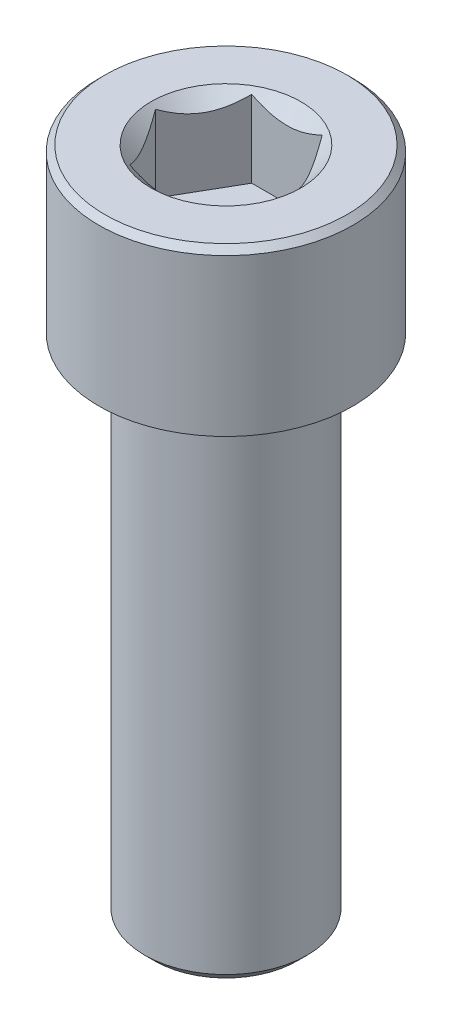
ISO-10303-21;
HEADER;
FILE_DESCRIPTION(('STEP AP214'),'2;1');
FILE_NAME('part.step','',(''),(''),'','','');
FILE_SCHEMA(('AUTOMOTIVE_DESIGN { 1 0 10303 214 1 1 1 1 }'));
ENDSEC;
DATA;
#1=APPLICATION_CONTEXT('core data for automotive mechanical design processes');
#2=APPLICATION_PROTOCOL_DEFINITION('international standard','automotive_design',2000,#1);
#3=PRODUCT_CONTEXT('',#1,'mechanical');
#4=PRODUCT('Part','Part','',(#3));
#5=PRODUCT_RELATED_PRODUCT_CATEGORY('part','',(#4));
#6=PRODUCT_DEFINITION_FORMATION('','',#4);
#7=PRODUCT_DEFINITION_CONTEXT('part definition',#1,'design');
#8=PRODUCT_DEFINITION('design','',#6,#7);
#9=PRODUCT_DEFINITION_SHAPE('','',#8);
#10=(LENGTH_UNIT() NAMED_UNIT(*) SI_UNIT(.MILLI.,.METRE.));
#11=(NAMED_UNIT(*) PLANE_ANGLE_UNIT() SI_UNIT($,.RADIAN.));
#12=(NAMED_UNIT(*) SI_UNIT($,.STERADIAN.) SOLID_ANGLE_UNIT());
#13=UNCERTAINTY_MEASURE_WITH_UNIT(LENGTH_MEASURE(1.E-05),#10,'distance_accuracy_value','');
#14=(GEOMETRIC_REPRESENTATION_CONTEXT(3) GLOBAL_UNCERTAINTY_ASSIGNED_CONTEXT((#13)) GLOBAL_UNIT_ASSIGNED_CONTEXT((#10,
#11,#12)) REPRESENTATION_CONTEXT('',''));
#15=CARTESIAN_POINT('',(0.,0.,0.));
#16=DIRECTION('',(0.,0.,1.));
#17=DIRECTION('',(1.,0.,0.));
#18=AXIS2_PLACEMENT_3D('',#15,#16,#17);
#19=CARTESIAN_POINT('',(0.,0.,0.));
#20=DIRECTION('',(0.,1.,0.));
#21=DIRECTION('',(0.,0.,1.));
#22=AXIS2_PLACEMENT_3D('',#19,#20,#21);
#23=PLANE('',#22);
#24=CARTESIAN_POINT('',(0.,0.,0.));
#25=DIRECTION('',(0.,1.,0.));
#26=DIRECTION('',(0.,0.,1.));
#27=AXIS2_PLACEMENT_3D('',#24,#25,#26);
#28=CIRCLE('',#27,3.5);
#29=CARTESIAN_POINT('',(0.,0.,3.5));
#30=VERTEX_POINT('',#29);
#31=EDGE_CURVE('E42',#30,#30,#28,.F.);
#32=ORIENTED_EDGE('',*,*,#31,.T.);
#33=EDGE_LOOP('',(#32));
#34=FACE_BOUND('',#33,.T.);
#35=ADVANCED_FACE('F34',(#34),#23,.F.);
#36=CARTESIAN_POINT('',(0.,0.,0.));
#37=DIRECTION('',(0.,-1.,0.));
#38=DIRECTION('',(0.,0.,-1.));
#39=AXIS2_PLACEMENT_3D('',#36,#37,#38);
#40=CYLINDRICAL_SURFACE('',#39,4.);
#41=CARTESIAN_POINT('',(0.,0.500000000000006,0.));
#42=DIRECTION('',(0.,1.,0.));
#43=DIRECTION('',(0.,0.,1.));
#44=AXIS2_PLACEMENT_3D('',#41,#42,#43);
#45=CIRCLE('',#44,4.);
#46=CARTESIAN_POINT('',(0.,0.500000000000006,4.));
#47=VERTEX_POINT('',#46);
#48=EDGE_CURVE('E11',#47,#47,#45,.T.);
#49=ORIENTED_EDGE('',*,*,#48,.T.);
#50=EDGE_LOOP('',(#49));
#51=FACE_BOUND('',#50,.T.);
#52=CARTESIAN_POINT('',(0.,25.,0.));
#53=DIRECTION('',(0.,-1.,0.));
#54=DIRECTION('',(0.,0.,-1.));
#55=AXIS2_PLACEMENT_3D('',#52,#53,#54);
#56=CIRCLE('',#55,4.);
#57=CARTESIAN_POINT('',(0.,25.,-4.));
#58=VERTEX_POINT('',#57);
#59=EDGE_CURVE('E119',#58,#58,#56,.T.);
#60=ORIENTED_EDGE('',*,*,#59,.T.);
#61=EDGE_LOOP('',(#60));
#62=FACE_BOUND('',#61,.T.);
#63=ADVANCED_FACE('F190',(#51,#62),#40,.T.);
#64=CARTESIAN_POINT('',(-4.,25.,0.));
#65=DIRECTION('',(0.,1.,0.));
#66=DIRECTION('',(0.,0.,1.));
#67=AXIS2_PLACEMENT_3D('',#64,#65,#66);
#68=PLANE('',#67);
#69=ORIENTED_EDGE('',*,*,#59,.F.);
#70=EDGE_LOOP('',(#69));
#71=FACE_BOUND('',#70,.T.);
#72=CARTESIAN_POINT('',(0.,25.,0.));
#73=DIRECTION('',(0.,-1.,0.));
#74=DIRECTION('',(0.,0.,-1.));
#75=AXIS2_PLACEMENT_3D('',#72,#73,#74);
#76=CIRCLE('',#75,6.25);
#77=CARTESIAN_POINT('',(0.,25.,-6.25));
#78=VERTEX_POINT('',#77);
#79=EDGE_CURVE('E116',#78,#78,#76,.T.);
#80=ORIENTED_EDGE('',*,*,#79,.T.);
#81=EDGE_LOOP('',(#80));
#82=FACE_BOUND('',#81,.T.);
#83=ADVANCED_FACE('F196',(#71,#82),#68,.F.);
#84=CARTESIAN_POINT('',(0.,0.,0.));
#85=DIRECTION('',(0.,-1.,0.));
#86=DIRECTION('',(0.,0.,-1.));
#87=AXIS2_PLACEMENT_3D('',#84,#85,#86);
#88=CYLINDRICAL_SURFACE('',#87,6.25);
#89=CARTESIAN_POINT('',(0.,32.7,0.));
#90=DIRECTION('',(0.,-1.,0.));
#91=DIRECTION('',(0.,0.,-1.));
#92=AXIS2_PLACEMENT_3D('',#89,#90,#91);
#93=CIRCLE('',#92,6.25);
#94=CARTESIAN_POINT('',(0.,32.7,-6.25));
#95=VERTEX_POINT('',#94);
#96=EDGE_CURVE('E122',#95,#95,#93,.T.);
#97=ORIENTED_EDGE('',*,*,#96,.T.);
#98=EDGE_LOOP('',(#97));
#99=FACE_BOUND('',#98,.T.);
#100=ORIENTED_EDGE('',*,*,#79,.F.);
#101=EDGE_LOOP('',(#100));
#102=FACE_BOUND('',#101,.T.);
#103=ADVANCED_FACE('F207',(#99,#102),#88,.T.);
#104=CARTESIAN_POINT('',(-6.25,33.,0.));
#105=DIRECTION('',(0.,-1.,0.));
#106=DIRECTION('',(0.,0.,-1.));
#107=AXIS2_PLACEMENT_3D('',#104,#105,#106);
#108=PLANE('',#107);
#109=CARTESIAN_POINT('',(0.,33.,0.));
#110=DIRECTION('',(0.,1.,0.));
#111=DIRECTION('',(0.,0.,1.));
#112=AXIS2_PLACEMENT_3D('',#109,#110,#111);
#113=CIRCLE('',#112,3.68172134015619);
#114=CARTESIAN_POINT('',(0.,33.,3.68172134015619));
#115=VERTEX_POINT('',#114);
#116=EDGE_CURVE('E337',#115,#115,#113,.T.);
#117=ORIENTED_EDGE('',*,*,#116,.F.);
#118=EDGE_LOOP('',(#117));
#119=FACE_BOUND('',#118,.T.);
#120=CARTESIAN_POINT('',(0.,33.,0.));
#121=DIRECTION('',(0.,-1.,0.));
#122=DIRECTION('',(0.,0.,-1.));
#123=AXIS2_PLACEMENT_3D('',#120,#121,#122);
#124=CIRCLE('',#123,5.95);
#125=CARTESIAN_POINT('',(0.,33.,-5.95));
#126=VERTEX_POINT('',#125);
#127=EDGE_CURVE('E93',#126,#126,#124,.F.);
#128=ORIENTED_EDGE('',*,*,#127,.T.);
#129=EDGE_LOOP('',(#128));
#130=FACE_BOUND('',#129,.T.);
#131=ADVANCED_FACE('F202',(#119,#130),#108,.F.);
#132=CARTESIAN_POINT('',(0.,32.7,0.));
#133=DIRECTION('',(0.,-1.,0.));
#134=DIRECTION('',(0.,0.,-1.));
#135=AXIS2_PLACEMENT_3D('',#132,#133,#134);
#136=CONICAL_SURFACE('',#135,6.25,0.785398163397447);
#137=ORIENTED_EDGE('',*,*,#127,.F.);
#138=EDGE_LOOP('',(#137));
#139=FACE_BOUND('',#138,.T.);
#140=ORIENTED_EDGE('',*,*,#96,.F.);
#141=EDGE_LOOP('',(#140));
#142=FACE_BOUND('',#141,.T.);
#143=ADVANCED_FACE('F138',(#139,#142),#136,.T.);
#144=CARTESIAN_POINT('',(0.,33.,0.));
#145=DIRECTION('',(0.,1.,0.));
#146=DIRECTION('',(0.,0.,1.));
#147=AXIS2_PLACEMENT_3D('',#144,#145,#146);
#148=CONICAL_SURFACE('',#147,3.68172134015619,0.785398163397449);
#149=ORIENTED_EDGE('',*,*,#116,.T.);
#150=EDGE_LOOP('',(#149));
#151=FACE_BOUND('',#150,.T.);
#152=CARTESIAN_POINT('',(-3.57414153717217,33.9845928078346,3.));
#153=CARTESIAN_POINT('',(-3.48763354421076,33.918347344031,3.));
#154=CARTESIAN_POINT('',(-3.40065485701271,33.8527068014046,3.));
#155=CARTESIAN_POINT('',(-3.22556536628367,33.7229105596247,3.));
#156=CARTESIAN_POINT('',(-3.13745429592207,33.6587552207989,3.));
#157=CARTESIAN_POINT('',(-2.95926502940819,33.5317477625692,3.));
#158=CARTESIAN_POINT('',(-2.86917689491203,33.4689095404859,3.));
#159=CARTESIAN_POINT('',(-2.68749351951163,33.3454583721269,3.));
#160=CARTESIAN_POINT('',(-2.5958983836401,33.2848452717117,3.));
#161=CARTESIAN_POINT('',(-2.40523426187287,33.1626856152111,3.));
#162=CARTESIAN_POINT('',(-2.30605328102178,33.1013129786067,3.));
#163=CARTESIAN_POINT('',(-2.10536506104801,32.9824325210317,3.));
#164=CARTESIAN_POINT('',(-2.00385743987678,32.9249253409785,3.));
#165=CARTESIAN_POINT('',(-1.79849745550954,32.8150046063731,3.));
#166=CARTESIAN_POINT('',(-1.69465316441122,32.7625760890662,3.));
#167=CARTESIAN_POINT('',(-1.48405420683512,32.663987161909,3.));
#168=CARTESIAN_POINT('',(-1.37730092797841,32.6178238242346,3.));
#169=CARTESIAN_POINT('',(-1.17088222190216,32.5374103113695,3.));
#170=CARTESIAN_POINT('',(-1.07149734601239,32.5024473221765,3.));
#171=CARTESIAN_POINT('',(-0.870230144552074,32.4404802404136,3.));
#172=CARTESIAN_POINT('',(-0.768347657354245,32.4134766643998,3.));
#173=CARTESIAN_POINT('',(-0.56444762477906,32.3693266023403,3.));
#174=CARTESIAN_POINT('',(-0.462468933304163,32.3520036676269,3.));
#175=CARTESIAN_POINT('',(-0.257288650084503,32.3275703633682,3.));
#176=CARTESIAN_POINT('',(-0.154087304614488,32.3204579712627,3.));
#177=CARTESIAN_POINT('',(0.0481861337271405,32.3170323431805,3.));
#178=CARTESIAN_POINT('',(0.147250905244534,32.3202810238262,3.));
#179=CARTESIAN_POINT('',(0.344589076655321,32.3364014246806,3.));
#180=CARTESIAN_POINT('',(0.442862402476964,32.3492740352571,3.));
#181=CARTESIAN_POINT('',(0.639570667541511,32.3841396910622,3.));
#182=CARTESIAN_POINT('',(0.737976852204936,32.4062922789742,3.));
#183=CARTESIAN_POINT('',(0.932628435913932,32.4585009084323,3.));
#184=CARTESIAN_POINT('',(1.02887397223985,32.4885564463,3.));
#185=CARTESIAN_POINT('',(1.22532003458176,32.5574747225556,3.));
#186=CARTESIAN_POINT('',(1.32536043310458,32.5967888675383,3.));
#187=CARTESIAN_POINT('',(1.5228495241282,32.6814775662887,3.));
#188=CARTESIAN_POINT('',(1.62029736425404,32.7268540844093,3.));
#189=CARTESIAN_POINT('',(1.8130860429893,32.8225985437204,3.));
#190=CARTESIAN_POINT('',(1.90841896877326,32.8729822890255,3.));
#191=CARTESIAN_POINT('',(2.09689622819786,32.9776272778976,3.));
#192=CARTESIAN_POINT('',(2.19004094502823,33.031887835746,3.));
#193=CARTESIAN_POINT('',(2.36987261179099,33.1407691556288,3.));
#194=CARTESIAN_POINT('',(2.45665114613525,33.1952394529636,3.));
#195=CARTESIAN_POINT('',(2.62871750489487,33.3064926464856,3.));
#196=CARTESIAN_POINT('',(2.71400521657293,33.3632757164947,3.));
#197=CARTESIAN_POINT('',(2.88259790064295,33.4782780272199,3.));
#198=CARTESIAN_POINT('',(2.96591330750258,33.5364820260229,3.));
#199=CARTESIAN_POINT('',(3.13140205426231,33.6544457904063,3.));
#200=CARTESIAN_POINT('',(3.21357570254096,33.7142051228644,3.));
#201=CARTESIAN_POINT('',(3.29527058173678,33.7746009335197,3.));
#202=B_SPLINE_CURVE_WITH_KNOTS('',3,(#152,#153,#154,#155,#156,#157,#158,#159,#160,#161,#162,
#163,#164,#165,#166,#167,#168,#169,#170,#171,#172,#173,#174,#175,#176,#177,#178,#179,#180,#181,
#182,#183,#184,#185,#186,#187,#188,#189,#190,#191,#192,#193,#194,#195,#196,#197,#198,#199,#200,
#201),.UNSPECIFIED.,.F.,.F.,(4,2,2,2,2,2,2,2,2,2,2,2,2,2,2,2,2,2,2,2,2,2,2,2,4),(0.,
0.326883534696339,0.653845561216814,0.983333574679484,1.31279872045119,1.66263039077581,
2.01251992306797,2.36134508374106,2.71000666706381,3.02579926641578,3.34161235580211,
3.65146388205707,3.96125402275306,4.25812208285704,4.55501761141499,4.85724167639794,
5.15944648441815,5.48166266665301,5.80398350895795,6.12735610013866,6.45067163510514,
6.75800096012908,7.06535342598929,7.37023156667126,7.67502569596997),.UNSPECIFIED.);
#203=CARTESIAN_POINT('',(-1.73205080756888,32.7823802749816,3.));
#204=VERTEX_POINT('',#203);
#205=CARTESIAN_POINT('',(1.73205080756888,32.7823802749816,3.));
#206=VERTEX_POINT('',#205);
#207=EDGE_CURVE('E100',#204,#206,#202,.T.);
#208=ORIENTED_EDGE('',*,*,#207,.F.);
#209=CARTESIAN_POINT('',(-3.46421708519159,32.7824957508087,-0.000199999999999535));
#210=CARTESIAN_POINT('',(-3.40467869607211,32.7230085933033,0.102923514955747));
#211=CARTESIAN_POINT('',(-3.3441447475778,32.6670152544471,0.207771389330649));
#212=CARTESIAN_POINT('',(-3.2207094063533,32.5644928713605,0.421567671781097));
#213=CARTESIAN_POINT('',(-3.15779627521275,32.5180208687229,0.530536411379762));
#214=CARTESIAN_POINT('',(-3.03093496880241,32.4384134634979,0.750266639597033));
#215=CARTESIAN_POINT('',(-2.96701910000606,32.4050779756242,0.860972171762216));
#216=CARTESIAN_POINT('',(-2.83778025907546,32.3537178189609,1.08482041056533));
#217=CARTESIAN_POINT('',(-2.77246123486019,32.3356548125172,1.197956279207));
#218=CARTESIAN_POINT('',(-2.65988677911464,32.3193571834321,1.39294095619271));
#219=CARTESIAN_POINT('',(-2.6127767304643,32.3169446421554,1.47453795400214));
#220=CARTESIAN_POINT('',(-2.51863325954798,32.3210097096387,1.6375992288301));
#221=CARTESIAN_POINT('',(-2.47159986993093,32.3274904350099,1.71906344929899));
#222=CARTESIAN_POINT('',(-2.37797867687426,32.3489719974968,1.88122011233838));
#223=CARTESIAN_POINT('',(-2.33139143122689,32.3639823649488,1.96191158878431));
#224=CARTESIAN_POINT('',(-2.23901705721438,32.4017039210476,2.12190869789134));
#225=CARTESIAN_POINT('',(-2.19322986779049,32.4244145193044,2.2012144363093));
#226=CARTESIAN_POINT('',(-2.11194373930153,32.4711409598355,2.34200614080276));
#227=CARTESIAN_POINT('',(-2.07626488907772,32.4939286026624,2.40380372214603));
#228=CARTESIAN_POINT('',(-2.00554773988155,32.543176561039,2.52628941752022));
#229=CARTESIAN_POINT('',(-1.97050946049033,32.5696369886478,2.58697749763561));
#230=CARTESIAN_POINT('',(-1.90118383838356,32.6256372693729,2.70705299739087));
#231=CARTESIAN_POINT('',(-1.86689452386373,32.6551674394599,2.76644383229592));
#232=CARTESIAN_POINT('',(-1.79895094584795,32.7169193665571,2.88412556146727));
#233=CARTESIAN_POINT('',(-1.76529630793217,32.7491394716409,2.94241710424773));
#234=CARTESIAN_POINT('',(-1.73193533751504,32.7824957508087,3.0002));
#235=B_SPLINE_CURVE_WITH_KNOTS('',3,(#209,#210,#211,#212,#213,#214,#215,#216,#217,#218,#219,
#220,#221,#222,#223,#224,#225,#226,#227,#228,#229,#230,#231,#232,#233,#234),.UNSPECIFIED.,.F.,
.F.,(4,2,2,2,2,2,2,2,2,2,2,2,4),(0.,0.399603557139305,0.801535286397847,1.19708369162343,
1.59163620080173,1.87398941755845,2.15644160919093,2.43921001247425,2.72195674032138,
2.94657516661927,3.17120044767275,3.3951375283781,3.61893808380739),.UNSPECIFIED.);
#236=CARTESIAN_POINT('',(-3.46410161513776,32.7823802749816,0.));
#237=VERTEX_POINT('',#236);
#238=EDGE_CURVE('E158',#237,#204,#235,.T.);
#239=ORIENTED_EDGE('',*,*,#238,.F.);
#240=CARTESIAN_POINT('',(-1.73193533751504,32.7824957508087,-3.0002));
#241=CARTESIAN_POINT('',(-1.79147372663452,32.7230085933033,-2.89707648504425));
#242=CARTESIAN_POINT('',(-1.85200767512883,32.6670152544471,-2.79222861066935));
#243=CARTESIAN_POINT('',(-1.97544301635334,32.5644928713605,-2.5784323282189));
#244=CARTESIAN_POINT('',(-2.03835614749388,32.5180208687229,-2.46946358862024));
#245=CARTESIAN_POINT('',(-2.16521745390422,32.4384134634979,-2.24973336040297));
#246=CARTESIAN_POINT('',(-2.22913332270057,32.4050779756242,-2.13902782823779));
#247=CARTESIAN_POINT('',(-2.35837216363116,32.3537178189609,-1.91517958943468));
#248=CARTESIAN_POINT('',(-2.42369118784643,32.3356548125172,-1.80204372079301));
#249=CARTESIAN_POINT('',(-2.53626564359198,32.3193571834321,-1.60705904380731));
#250=CARTESIAN_POINT('',(-2.58337569224232,32.3169446421554,-1.52546204599788));
#251=CARTESIAN_POINT('',(-2.67751916315865,32.3210097096387,-1.36240077116992));
#252=CARTESIAN_POINT('',(-2.72455255277569,32.3274904350099,-1.28093655070102));
#253=CARTESIAN_POINT('',(-2.81817374583237,32.3489719974968,-1.11877988766164));
#254=CARTESIAN_POINT('',(-2.86476099147974,32.3639823649488,-1.03808841121571));
#255=CARTESIAN_POINT('',(-2.95713536549224,32.4017039210476,-0.878091302108675));
#256=CARTESIAN_POINT('',(-3.00292255491613,32.4244145193044,-0.798785563690714));
#257=CARTESIAN_POINT('',(-3.0842086834051,32.4711409598355,-0.657993859197257));
#258=CARTESIAN_POINT('',(-3.11988753362891,32.4939286026624,-0.596196277853983));
#259=CARTESIAN_POINT('',(-3.19060468282508,32.543176561039,-0.473710582479787));
#260=CARTESIAN_POINT('',(-3.2256429622163,32.5696369886478,-0.413022502364402));
#261=CARTESIAN_POINT('',(-3.29496858432307,32.6256372693729,-0.292947002609142));
#262=CARTESIAN_POINT('',(-3.3292578988429,32.6551674394599,-0.233556167704087));
#263=CARTESIAN_POINT('',(-3.39720147685868,32.7169193665571,-0.115874438532736));
#264=CARTESIAN_POINT('',(-3.43085611477446,32.7491394716409,-0.0575828957522694));
#265=CARTESIAN_POINT('',(-3.46421708519159,32.7824957508087,0.000199999999998092));
#266=B_SPLINE_CURVE_WITH_KNOTS('',3,(#240,#241,#242,#243,#244,#245,#246,#247,#248,#249,#250,
#251,#252,#253,#254,#255,#256,#257,#258,#259,#260,#261,#262,#263,#264,#265),.UNSPECIFIED.,.F.,
.F.,(4,2,2,2,2,2,2,2,2,2,2,2,4),(0.,0.399603557139304,0.801535286397841,1.19708369162342,
1.59163620080172,1.87398941755843,2.15644160919091,2.43921001247424,2.72195674032137,
2.94657516661926,3.17120044767274,3.39513752837809,3.61893808380739),.UNSPECIFIED.);
#267=CARTESIAN_POINT('',(-1.73205080756888,32.7823802749816,-3.));
#268=VERTEX_POINT('',#267);
#269=EDGE_CURVE('E152',#268,#237,#266,.T.);
#270=ORIENTED_EDGE('',*,*,#269,.F.);
#271=CARTESIAN_POINT('',(-3.57414153716177,33.9845928078267,-3.));
#272=CARTESIAN_POINT('',(-3.48763354420067,33.9183473440233,-3.));
#273=CARTESIAN_POINT('',(-3.40065485700291,33.8527068013973,-3.));
#274=CARTESIAN_POINT('',(-3.22556536627447,33.7229105596179,-3.));
#275=CARTESIAN_POINT('',(-3.13745429591317,33.6587552207925,-3.));
#276=CARTESIAN_POINT('',(-2.9592650293999,33.5317477625634,-3.));
#277=CARTESIAN_POINT('',(-2.86917689490406,33.4689095404804,-3.));
#278=CARTESIAN_POINT('',(-2.68749351950429,33.345458372122,-3.));
#279=CARTESIAN_POINT('',(-2.59589838363307,33.2848452717071,-3.));
#280=CARTESIAN_POINT('',(-2.40523426186653,33.1626856152071,-3.));
#281=CARTESIAN_POINT('',(-2.30605328101581,33.1013129786031,-3.));
#282=CARTESIAN_POINT('',(-2.10536506104279,32.9824325210287,-3.));
#283=CARTESIAN_POINT('',(-2.00385743987194,32.9249253409758,-3.));
#284=CARTESIAN_POINT('',(-1.79849745550548,32.815004606371,-3.));
#285=CARTESIAN_POINT('',(-1.69465316440755,32.7625760890644,-3.));
#286=CARTESIAN_POINT('',(-1.48405420683226,32.6639871619078,-3.));
#287=CARTESIAN_POINT('',(-1.37730092797597,32.6178238242335,-3.));
#288=CARTESIAN_POINT('',(-1.1708822218999,32.5374103113687,-3.));
#289=CARTESIAN_POINT('',(-1.07149734600987,32.5024473221756,-3.));
#290=CARTESIAN_POINT('',(-0.870230144549025,32.4404802404128,-3.));
#291=CARTESIAN_POINT('',(-0.768347657350926,32.413476664399,-3.));
#292=CARTESIAN_POINT('',(-0.564447624775211,32.3693266023395,-3.));
#293=CARTESIAN_POINT('',(-0.462468933300054,32.3520036676262,-3.));
#294=CARTESIAN_POINT('',(-0.257288650079879,32.3275703633678,-3.));
#295=CARTESIAN_POINT('',(-0.15408730460961,32.3204579712624,-3.));
#296=CARTESIAN_POINT('',(0.0481861337324599,32.3170323431805,-3.));
#297=CARTESIAN_POINT('',(0.147250905250041,32.3202810238264,-3.));
#298=CARTESIAN_POINT('',(0.344589076661184,32.3364014246813,-3.));
#299=CARTESIAN_POINT('',(0.442862402482994,32.349274035258,-3.));
#300=CARTESIAN_POINT('',(0.639570667547872,32.3841396910636,-3.));
#301=CARTESIAN_POINT('',(0.737976852211459,32.4062922789758,-3.));
#302=CARTESIAN_POINT('',(0.932628435920763,32.4585009084343,-3.));
#303=CARTESIAN_POINT('',(1.02887397224682,32.4885564463023,-3.));
#304=CARTESIAN_POINT('',(1.22532003458955,32.5574747225585,-3.));
#305=CARTESIAN_POINT('',(1.32536043311303,32.5967888675417,-3.));
#306=CARTESIAN_POINT('',(1.52284952413793,32.6814775662931,-3.));
#307=CARTESIAN_POINT('',(1.62029736426439,32.7268540844142,-3.));
#308=CARTESIAN_POINT('',(1.81308604300087,32.8225985437264,-3.));
#309=CARTESIAN_POINT('',(1.90841896878543,32.8729822890321,-3.));
#310=CARTESIAN_POINT('',(2.0968962282112,32.9776272779052,-3.));
#311=CARTESIAN_POINT('',(2.19004094504216,33.0318878357542,-3.));
#312=CARTESIAN_POINT('',(2.36987261180596,33.1407691556381,-3.));
#313=CARTESIAN_POINT('',(2.4566511461507,33.1952394529734,-3.));
#314=CARTESIAN_POINT('',(2.62871750491127,33.3064926464964,-3.));
#315=CARTESIAN_POINT('',(2.71400521658979,33.363275716506,-3.));
#316=CARTESIAN_POINT('',(2.88259790066074,33.4782780272322,-3.));
#317=CARTESIAN_POINT('',(2.96591330752083,33.5364820260357,-3.));
#318=CARTESIAN_POINT('',(3.13140205428147,33.6544457904201,-3.));
#319=CARTESIAN_POINT('',(3.21357570256057,33.7142051228787,-3.));
#320=CARTESIAN_POINT('',(3.29527058175686,33.7746009335346,-3.));
#321=B_SPLINE_CURVE_WITH_KNOTS('',3,(#271,#272,#273,#274,#275,#276,#277,#278,#279,#280,#281,
#282,#283,#284,#285,#286,#287,#288,#289,#290,#291,#292,#293,#294,#295,#296,#297,#298,#299,#300,
#301,#302,#303,#304,#305,#306,#307,#308,#309,#310,#311,#312,#313,#314,#315,#316,#317,#318,#319,
#320),.UNSPECIFIED.,.F.,.F.,(4,2,2,2,2,2,2,2,2,2,2,2,2,2,2,2,2,2,2,2,2,2,2,2,4),(0.,
0.326883534695071,0.653845561214273,0.983333574675654,1.31279872044605,1.66263039076922,
2.01251992305993,2.36134508373157,2.71000666705287,3.0257992664056,3.34161235579269,
3.65146388204837,3.96125402274508,4.25812208284965,4.55501761140818,4.85724167639176,
5.1594464844126,5.4816626666498,5.80398350895708,6.12735610014015,6.45067163510899,
6.75800096013495,7.06535342599717,7.37023156668113,7.67502569598184),.UNSPECIFIED.);
#322=CARTESIAN_POINT('',(1.73205080756888,32.7823802749816,-3.));
#323=VERTEX_POINT('',#322);
#324=EDGE_CURVE('E49',#323,#268,#321,.F.);
#325=ORIENTED_EDGE('',*,*,#324,.F.);
#326=CARTESIAN_POINT('',(3.46421708519159,32.7824957508087,0.000199999999998427));
#327=CARTESIAN_POINT('',(3.40467869607211,32.7230085933033,-0.10292351495575));
#328=CARTESIAN_POINT('',(3.3441447475778,32.6670152544471,-0.207771389330652));
#329=CARTESIAN_POINT('',(3.22070940635329,32.5644928713605,-0.421567671781098));
#330=CARTESIAN_POINT('',(3.15779627521275,32.5180208687229,-0.530536411379762));
#331=CARTESIAN_POINT('',(3.03093496880241,32.4384134634979,-0.750266639597029));
#332=CARTESIAN_POINT('',(2.96701910000606,32.4050779756242,-0.860972171762211));
#333=CARTESIAN_POINT('',(2.83778025907547,32.3537178189609,-1.08482041056532));
#334=CARTESIAN_POINT('',(2.7724612348602,32.3356548125172,-1.19795627920699));
#335=CARTESIAN_POINT('',(2.65988677911464,32.3193571834321,-1.3929409561927));
#336=CARTESIAN_POINT('',(2.6127767304643,32.3169446421554,-1.47453795400213));
#337=CARTESIAN_POINT('',(2.51863325954798,32.3210097096387,-1.63759922883009));
#338=CARTESIAN_POINT('',(2.47159986993094,32.3274904350099,-1.71906344929898));
#339=CARTESIAN_POINT('',(2.37797867687426,32.3489719974968,-1.88122011233837));
#340=CARTESIAN_POINT('',(2.33139143122689,32.3639823649488,-1.9619115887843));
#341=CARTESIAN_POINT('',(2.23901705721439,32.4017039210476,-2.12190869789133));
#342=CARTESIAN_POINT('',(2.19322986779049,32.4244145193044,-2.20121443630929));
#343=CARTESIAN_POINT('',(2.11194373930153,32.4711409598355,-2.34200614080275));
#344=CARTESIAN_POINT('',(2.07626488907772,32.4939286026624,-2.40380372214602));
#345=CARTESIAN_POINT('',(2.00554773988155,32.543176561039,-2.52628941752022));
#346=CARTESIAN_POINT('',(1.97050946049033,32.5696369886478,-2.5869774976356));
#347=CARTESIAN_POINT('',(1.90118383838356,32.6256372693729,-2.70705299739086));
#348=CARTESIAN_POINT('',(1.86689452386372,32.6551674394599,-2.76644383229592));
#349=CARTESIAN_POINT('',(1.79895094584794,32.7169193665571,-2.88412556146727));
#350=CARTESIAN_POINT('',(1.76529630793216,32.7491394716409,-2.94241710424773));
#351=CARTESIAN_POINT('',(1.73193533751504,32.7824957508087,-3.0002));
#352=B_SPLINE_CURVE_WITH_KNOTS('',3,(#326,#327,#328,#329,#330,#331,#332,#333,#334,#335,#336,
#337,#338,#339,#340,#341,#342,#343,#344,#345,#346,#347,#348,#349,#350,#351),.UNSPECIFIED.,.F.,
.F.,(4,2,2,2,2,2,2,2,2,2,2,2,4),(0.,0.399603557139307,0.801535286397844,1.19708369162343,
1.59163620080172,1.87398941755844,2.15644160919092,2.43921001247424,2.72195674032137,
2.94657516661926,3.17120044767274,3.3951375283781,3.61893808380739),.UNSPECIFIED.);
#353=CARTESIAN_POINT('',(3.46410161513776,32.7823802749816,0.));
#354=VERTEX_POINT('',#353);
#355=EDGE_CURVE('E86',#354,#323,#352,.T.);
#356=ORIENTED_EDGE('',*,*,#355,.F.);
#357=CARTESIAN_POINT('',(1.73193533751504,32.7824957508087,3.0002));
#358=CARTESIAN_POINT('',(1.79147372663452,32.7230085933033,2.89707648504425));
#359=CARTESIAN_POINT('',(1.85200767512883,32.6670152544471,2.79222861066935));
#360=CARTESIAN_POINT('',(1.97544301635334,32.5644928713605,2.5784323282189));
#361=CARTESIAN_POINT('',(2.03835614749388,32.5180208687229,2.46946358862024));
#362=CARTESIAN_POINT('',(2.16521745390422,32.4384134634979,2.24973336040297));
#363=CARTESIAN_POINT('',(2.22913332270057,32.4050779756242,2.13902782823779));
#364=CARTESIAN_POINT('',(2.35837216363117,32.3537178189609,1.91517958943468));
#365=CARTESIAN_POINT('',(2.42369118784644,32.3356548125172,1.80204372079301));
#366=CARTESIAN_POINT('',(2.53626564359199,32.3193571834321,1.6070590438073));
#367=CARTESIAN_POINT('',(2.58337569224233,32.3169446421554,1.52546204599787));
#368=CARTESIAN_POINT('',(2.67751916315865,32.3210097096387,1.36240077116992));
#369=CARTESIAN_POINT('',(2.72455255277569,32.3274904350099,1.28093655070102));
#370=CARTESIAN_POINT('',(2.81817374583237,32.3489719974968,1.11877988766164));
#371=CARTESIAN_POINT('',(2.86476099147974,32.3639823649488,1.0380884112157));
#372=CARTESIAN_POINT('',(2.95713536549224,32.4017039210476,0.878091302108671));
#373=CARTESIAN_POINT('',(3.00292255491614,32.4244145193044,0.79878556369071));
#374=CARTESIAN_POINT('',(3.0842086834051,32.4711409598355,0.657993859197252));
#375=CARTESIAN_POINT('',(3.11988753362891,32.4939286026624,0.596196277853978));
#376=CARTESIAN_POINT('',(3.19060468282508,32.543176561039,0.473710582479783));
#377=CARTESIAN_POINT('',(3.2256429622163,32.5696369886478,0.413022502364398));
#378=CARTESIAN_POINT('',(3.29496858432308,32.6256372693729,0.292947002609137));
#379=CARTESIAN_POINT('',(3.32925789884291,32.6551674394599,0.233556167704081));
#380=CARTESIAN_POINT('',(3.39720147685869,32.7169193665571,0.115874438532729));
#381=CARTESIAN_POINT('',(3.43085611477447,32.7491394716409,0.0575828957522644));
#382=CARTESIAN_POINT('',(3.46421708519159,32.7824957508087,-0.000200000000000615));
#383=B_SPLINE_CURVE_WITH_KNOTS('',3,(#357,#358,#359,#360,#361,#362,#363,#364,#365,#366,#367,
#368,#369,#370,#371,#372,#373,#374,#375,#376,#377,#378,#379,#380,#381,#382),.UNSPECIFIED.,.F.,
.F.,(4,2,2,2,2,2,2,2,2,2,2,2,4),(0.,0.399603557139308,0.801535286397844,1.19708369162343,
1.59163620080172,1.87398941755844,2.15644160919092,2.43921001247424,2.72195674032137,
2.94657516661926,3.17120044767274,3.3951375283781,3.61893808380739),.UNSPECIFIED.);
#384=EDGE_CURVE('E89',#206,#354,#383,.T.);
#385=ORIENTED_EDGE('',*,*,#384,.F.);
#386=EDGE_LOOP('',(#208,#239,#270,#325,#356,#385));
#387=FACE_BOUND('',#386,.T.);
#388=ADVANCED_FACE('F88',(#151,#387),#148,.F.);
#389=CARTESIAN_POINT('',(3.46410161513775,29.,0.));
#390=DIRECTION('',(0.,1.,0.));
#391=DIRECTION('',(0.,0.,1.));
#392=AXIS2_PLACEMENT_3D('',#389,#390,#391);
#393=PLANE('',#392);
#394=DIRECTION('',(0.5,0.,-0.866025403784439));
#395=VECTOR('',#394,1.);
#396=CARTESIAN_POINT('',(1.73205080756888,29.,3.));
#397=LINE('',#396,#395);
#398=CARTESIAN_POINT('',(1.73205080756888,29.,3.));
#399=VERTEX_POINT('',#398);
#400=CARTESIAN_POINT('',(3.46410161513775,29.,0.));
#401=VERTEX_POINT('',#400);
#402=EDGE_CURVE('E99',#399,#401,#397,.T.);
#403=ORIENTED_EDGE('',*,*,#402,.T.);
#404=DIRECTION('',(-0.5,0.,-0.866025403784438));
#405=VECTOR('',#404,1.);
#406=CARTESIAN_POINT('',(3.46410161513775,29.,0.));
#407=LINE('',#406,#405);
#408=CARTESIAN_POINT('',(1.73205080756888,29.,-3.));
#409=VERTEX_POINT('',#408);
#410=EDGE_CURVE('E104',#401,#409,#407,.T.);
#411=ORIENTED_EDGE('',*,*,#410,.T.);
#412=DIRECTION('',(-1.,0.,0.));
#413=VECTOR('',#412,1.);
#414=CARTESIAN_POINT('',(1.73205080756888,29.,-3.));
#415=LINE('',#414,#413);
#416=CARTESIAN_POINT('',(-1.73205080756888,29.,-3.));
#417=VERTEX_POINT('',#416);
#418=EDGE_CURVE('E319',#409,#417,#415,.T.);
#419=ORIENTED_EDGE('',*,*,#418,.T.);
#420=DIRECTION('',(-0.5,0.,0.866025403784439));
#421=VECTOR('',#420,1.);
#422=CARTESIAN_POINT('',(-1.73205080756888,29.,-3.));
#423=LINE('',#422,#421);
#424=CARTESIAN_POINT('',(-3.46410161513776,29.,0.));
#425=VERTEX_POINT('',#424);
#426=EDGE_CURVE('E323',#417,#425,#423,.T.);
#427=ORIENTED_EDGE('',*,*,#426,.T.);
#428=DIRECTION('',(0.5,0.,0.866025403784439));
#429=VECTOR('',#428,1.);
#430=CARTESIAN_POINT('',(-3.46410161513776,29.,0.));
#431=LINE('',#430,#429);
#432=CARTESIAN_POINT('',(-1.73205080756888,29.,3.));
#433=VERTEX_POINT('',#432);
#434=EDGE_CURVE('E112',#425,#433,#431,.T.);
#435=ORIENTED_EDGE('',*,*,#434,.T.);
#436=DIRECTION('',(1.,0.,0.));
#437=VECTOR('',#436,1.);
#438=CARTESIAN_POINT('',(-1.73205080756888,29.,3.));
#439=LINE('',#438,#437);
#440=EDGE_CURVE('E107',#433,#399,#439,.T.);
#441=ORIENTED_EDGE('',*,*,#440,.T.);
#442=EDGE_LOOP('',(#403,#411,#419,#427,#435,#441));
#443=FACE_BOUND('',#442,.T.);
#444=ADVANCED_FACE('F137',(#443),#393,.T.);
#445=CARTESIAN_POINT('',(3.46410161513775,29.,0.));
#446=DIRECTION('',(0.866025403784439,0.,-0.5));
#447=DIRECTION('',(-0.5,0.,-0.866025403784438));
#448=AXIS2_PLACEMENT_3D('',#445,#446,#447);
#449=PLANE('',#448);
#450=DIRECTION('',(0.,1.,0.));
#451=VECTOR('',#450,1.);
#452=CARTESIAN_POINT('',(3.46410161513775,29.,0.));
#453=LINE('',#452,#451);
#454=EDGE_CURVE('E97',#401,#354,#453,.T.);
#455=ORIENTED_EDGE('',*,*,#454,.T.);
#456=ORIENTED_EDGE('',*,*,#355,.T.);
#457=DIRECTION('',(0.,1.,0.));
#458=VECTOR('',#457,1.);
#459=CARTESIAN_POINT('',(1.73205080756888,29.,-3.));
#460=LINE('',#459,#458);
#461=EDGE_CURVE('E106',#409,#323,#460,.T.);
#462=ORIENTED_EDGE('',*,*,#461,.F.);
#463=ORIENTED_EDGE('',*,*,#410,.F.);
#464=EDGE_LOOP('',(#455,#456,#462,#463));
#465=FACE_BOUND('',#464,.T.);
#466=ADVANCED_FACE('F102',(#465),#449,.F.);
#467=CARTESIAN_POINT('',(1.73205080756888,29.,-3.));
#468=DIRECTION('',(0.,0.,-1.));
#469=DIRECTION('',(-1.,0.,0.));
#470=AXIS2_PLACEMENT_3D('',#467,#468,#469);
#471=PLANE('',#470);
#472=ORIENTED_EDGE('',*,*,#461,.T.);
#473=ORIENTED_EDGE('',*,*,#324,.T.);
#474=DIRECTION('',(0.,1.,0.));
#475=VECTOR('',#474,1.);
#476=CARTESIAN_POINT('',(-1.73205080756888,29.,-3.));
#477=LINE('',#476,#475);
#478=EDGE_CURVE('E109',#417,#268,#477,.T.);
#479=ORIENTED_EDGE('',*,*,#478,.F.);
#480=ORIENTED_EDGE('',*,*,#418,.F.);
#481=EDGE_LOOP('',(#472,#473,#479,#480));
#482=FACE_BOUND('',#481,.T.);
#483=ADVANCED_FACE('F181',(#482),#471,.F.);
#484=CARTESIAN_POINT('',(-1.73205080756888,29.,-3.));
#485=DIRECTION('',(-0.866025403784439,0.,-0.5));
#486=DIRECTION('',(-0.5,0.,0.866025403784439));
#487=AXIS2_PLACEMENT_3D('',#484,#485,#486);
#488=PLANE('',#487);
#489=ORIENTED_EDGE('',*,*,#478,.T.);
#490=ORIENTED_EDGE('',*,*,#269,.T.);
#491=DIRECTION('',(0.,1.,0.));
#492=VECTOR('',#491,1.);
#493=CARTESIAN_POINT('',(-3.46410161513776,29.,0.));
#494=LINE('',#493,#492);
#495=EDGE_CURVE('E331',#425,#237,#494,.T.);
#496=ORIENTED_EDGE('',*,*,#495,.F.);
#497=ORIENTED_EDGE('',*,*,#426,.F.);
#498=EDGE_LOOP('',(#489,#490,#496,#497));
#499=FACE_BOUND('',#498,.T.);
#500=ADVANCED_FACE('F177',(#499),#488,.F.);
#501=CARTESIAN_POINT('',(-3.46410161513776,29.,0.));
#502=DIRECTION('',(-0.866025403784439,0.,0.5));
#503=DIRECTION('',(0.5,0.,0.866025403784439));
#504=AXIS2_PLACEMENT_3D('',#501,#502,#503);
#505=PLANE('',#504);
#506=ORIENTED_EDGE('',*,*,#495,.T.);
#507=ORIENTED_EDGE('',*,*,#238,.T.);
#508=DIRECTION('',(0.,1.,0.));
#509=VECTOR('',#508,1.);
#510=CARTESIAN_POINT('',(-1.73205080756888,29.,3.));
#511=LINE('',#510,#509);
#512=EDGE_CURVE('E328',#433,#204,#511,.T.);
#513=ORIENTED_EDGE('',*,*,#512,.F.);
#514=ORIENTED_EDGE('',*,*,#434,.F.);
#515=EDGE_LOOP('',(#506,#507,#513,#514));
#516=FACE_BOUND('',#515,.T.);
#517=ADVANCED_FACE('F174',(#516),#505,.F.);
#518=CARTESIAN_POINT('',(-1.73205080756888,29.,3.));
#519=DIRECTION('',(0.,0.,1.));
#520=DIRECTION('',(1.,0.,0.));
#521=AXIS2_PLACEMENT_3D('',#518,#519,#520);
#522=PLANE('',#521);
#523=ORIENTED_EDGE('',*,*,#512,.T.);
#524=ORIENTED_EDGE('',*,*,#207,.T.);
#525=DIRECTION('',(0.,1.,0.));
#526=VECTOR('',#525,1.);
#527=CARTESIAN_POINT('',(1.73205080756888,29.,3.));
#528=LINE('',#527,#526);
#529=EDGE_CURVE('E57',#399,#206,#528,.T.);
#530=ORIENTED_EDGE('',*,*,#529,.F.);
#531=ORIENTED_EDGE('',*,*,#440,.F.);
#532=EDGE_LOOP('',(#523,#524,#530,#531));
#533=FACE_BOUND('',#532,.T.);
#534=ADVANCED_FACE('F171',(#533),#522,.F.);
#535=CARTESIAN_POINT('',(1.73205080756888,29.,3.));
#536=DIRECTION('',(0.866025403784439,0.,0.5));
#537=DIRECTION('',(0.5,0.,-0.866025403784439));
#538=AXIS2_PLACEMENT_3D('',#535,#536,#537);
#539=PLANE('',#538);
#540=ORIENTED_EDGE('',*,*,#529,.T.);
#541=ORIENTED_EDGE('',*,*,#384,.T.);
#542=ORIENTED_EDGE('',*,*,#454,.F.);
#543=ORIENTED_EDGE('',*,*,#402,.F.);
#544=EDGE_LOOP('',(#540,#541,#542,#543));
#545=FACE_BOUND('',#544,.T.);
#546=ADVANCED_FACE('F96',(#545),#539,.F.);
#547=CARTESIAN_POINT('',(0.,0.,0.));
#548=DIRECTION('',(0.,1.,0.));
#549=DIRECTION('',(0.,0.,1.));
#550=AXIS2_PLACEMENT_3D('',#547,#548,#549);
#551=CONICAL_SURFACE('',#550,3.5,0.785398163397446);
#552=ORIENTED_EDGE('',*,*,#48,.F.);
#553=EDGE_LOOP('',(#552));
#554=FACE_BOUND('',#553,.T.);
#555=ORIENTED_EDGE('',*,*,#31,.F.);
#556=EDGE_LOOP('',(#555));
#557=FACE_BOUND('',#556,.T.);
#558=ADVANCED_FACE('F36',(#554,#557),#551,.T.);
#559=CLOSED_SHELL('',(#35,#63,#83,#103,#131,#143,#388,#444,#466,#483,#500,#517,#534,#546,#558));
#560=MANIFOLD_SOLID_BREP('B2',#559);
#561=ADVANCED_BREP_SHAPE_REPRESENTATION('',(#18,#560),#14);
#562=SHAPE_DEFINITION_REPRESENTATION(#9,#561);
ENDSEC;
END-ISO-10303-21;
